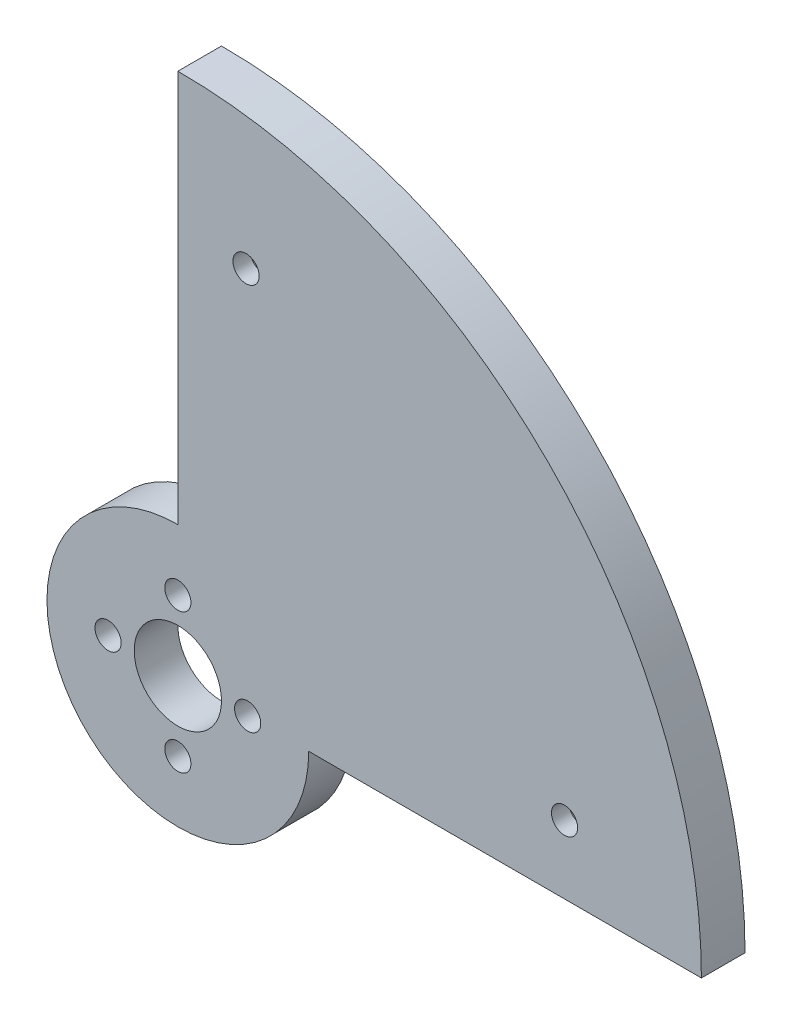
ISO-10303-21;
HEADER;
FILE_DESCRIPTION(('STEP AP214'),'2;1');
FILE_NAME('part.step','',(''),(''),'','','');
FILE_SCHEMA(('AUTOMOTIVE_DESIGN { 1 0 10303 214 1 1 1 1 }'));
ENDSEC;
DATA;
#1=APPLICATION_CONTEXT('core data for automotive mechanical design processes');
#2=APPLICATION_PROTOCOL_DEFINITION('international standard','automotive_design',2000,#1);
#3=PRODUCT_CONTEXT('',#1,'mechanical');
#4=PRODUCT('Part','Part','',(#3));
#5=PRODUCT_RELATED_PRODUCT_CATEGORY('part','',(#4));
#6=PRODUCT_DEFINITION_FORMATION('','',#4);
#7=PRODUCT_DEFINITION_CONTEXT('part definition',#1,'design');
#8=PRODUCT_DEFINITION('design','',#6,#7);
#9=PRODUCT_DEFINITION_SHAPE('','',#8);
#10=(LENGTH_UNIT() NAMED_UNIT(*) SI_UNIT(.MILLI.,.METRE.));
#11=(NAMED_UNIT(*) PLANE_ANGLE_UNIT() SI_UNIT($,.RADIAN.));
#12=(NAMED_UNIT(*) SI_UNIT($,.STERADIAN.) SOLID_ANGLE_UNIT());
#13=UNCERTAINTY_MEASURE_WITH_UNIT(LENGTH_MEASURE(1.E-05),#10,'distance_accuracy_value','');
#14=(GEOMETRIC_REPRESENTATION_CONTEXT(3) GLOBAL_UNCERTAINTY_ASSIGNED_CONTEXT((#13)) GLOBAL_UNIT_ASSIGNED_CONTEXT((#10,
#11,#12)) REPRESENTATION_CONTEXT('',''));
#15=CARTESIAN_POINT('',(0.,0.,0.));
#16=DIRECTION('',(0.,0.,1.));
#17=DIRECTION('',(1.,0.,0.));
#18=AXIS2_PLACEMENT_3D('',#15,#16,#17);
#19=CARTESIAN_POINT('',(60.,2.24184641920356E-13,5.));
#20=DIRECTION('',(0.,1.,0.));
#21=DIRECTION('',(-1.,0.,0.));
#22=AXIS2_PLACEMENT_3D('',#19,#20,#21);
#23=PLANE('',#22);
#24=DIRECTION('',(1.,0.,0.));
#25=VECTOR('',#24,1.);
#26=CARTESIAN_POINT('',(60.,2.24184641920356E-13,5.));
#27=LINE('',#26,#25);
#28=CARTESIAN_POINT('',(15.,0.,5.));
#29=VERTEX_POINT('',#28);
#30=CARTESIAN_POINT('',(60.,2.20510701522914E-13,5.));
#31=VERTEX_POINT('',#30);
#32=EDGE_CURVE('E101',#29,#31,#27,.T.);
#33=ORIENTED_EDGE('',*,*,#32,.F.);
#34=DIRECTION('',(0.,0.,1.));
#35=VECTOR('',#34,1.);
#36=CARTESIAN_POINT('',(15.,0.,0.));
#37=LINE('',#36,#35);
#38=CARTESIAN_POINT('',(15.,0.,0.));
#39=VERTEX_POINT('',#38);
#40=EDGE_CURVE('E173',#29,#39,#37,.F.);
#41=ORIENTED_EDGE('',*,*,#40,.T.);
#42=DIRECTION('',(1.,0.,0.));
#43=VECTOR('',#42,1.);
#44=CARTESIAN_POINT('',(60.,2.24184641920356E-13,0.));
#45=LINE('',#44,#43);
#46=CARTESIAN_POINT('',(60.,2.20510701522914E-13,0.));
#47=VERTEX_POINT('',#46);
#48=EDGE_CURVE('E86',#39,#47,#45,.T.);
#49=ORIENTED_EDGE('',*,*,#48,.T.);
#50=DIRECTION('',(0.,0.,-1.));
#51=VECTOR('',#50,1.);
#52=CARTESIAN_POINT('',(60.,2.20510701522914E-13,5.));
#53=LINE('',#52,#51);
#54=EDGE_CURVE('E81',#31,#47,#53,.T.);
#55=ORIENTED_EDGE('',*,*,#54,.F.);
#56=EDGE_LOOP('',(#33,#41,#49,#55));
#57=FACE_BOUND('',#56,.T.);
#58=ADVANCED_FACE('F37',(#57),#23,.F.);
#59=CARTESIAN_POINT('',(0.,0.,5.));
#60=DIRECTION('',(0.,0.,-1.));
#61=DIRECTION('',(-1.,0.,0.));
#62=AXIS2_PLACEMENT_3D('',#59,#60,#61);
#63=CYLINDRICAL_SURFACE('',#62,60.);
#64=CARTESIAN_POINT('',(0.,0.,0.));
#65=DIRECTION('',(0.,0.,1.));
#66=DIRECTION('',(-1.,0.,0.));
#67=AXIS2_PLACEMENT_3D('',#64,#65,#66);
#68=CIRCLE('',#67,60.);
#69=CARTESIAN_POINT('',(0.,60.,0.));
#70=VERTEX_POINT('',#69);
#71=EDGE_CURVE('E75',#47,#70,#68,.T.);
#72=ORIENTED_EDGE('',*,*,#71,.T.);
#73=DIRECTION('',(0.,0.,-1.));
#74=VECTOR('',#73,1.);
#75=CARTESIAN_POINT('',(0.,60.,5.));
#76=LINE('',#75,#74);
#77=CARTESIAN_POINT('',(0.,60.,5.));
#78=VERTEX_POINT('',#77);
#79=EDGE_CURVE('E78',#78,#70,#76,.T.);
#80=ORIENTED_EDGE('',*,*,#79,.F.);
#81=CARTESIAN_POINT('',(0.,0.,5.));
#82=DIRECTION('',(0.,0.,1.));
#83=DIRECTION('',(-1.,0.,0.));
#84=AXIS2_PLACEMENT_3D('',#81,#82,#83);
#85=CIRCLE('',#84,60.);
#86=EDGE_CURVE('E62',#31,#78,#85,.T.);
#87=ORIENTED_EDGE('',*,*,#86,.F.);
#88=ORIENTED_EDGE('',*,*,#54,.T.);
#89=EDGE_LOOP('',(#72,#80,#87,#88));
#90=FACE_BOUND('',#89,.T.);
#91=ADVANCED_FACE('F77',(#90),#63,.T.);
#92=CARTESIAN_POINT('',(0.,0.,5.));
#93=DIRECTION('',(1.,0.,0.));
#94=DIRECTION('',(0.,0.,-1.));
#95=AXIS2_PLACEMENT_3D('',#92,#93,#94);
#96=PLANE('',#95);
#97=DIRECTION('',(0.,-1.,0.));
#98=VECTOR('',#97,1.);
#99=CARTESIAN_POINT('',(0.,0.,0.));
#100=LINE('',#99,#98);
#101=CARTESIAN_POINT('',(0.,41.9615242270663,0.));
#102=VERTEX_POINT('',#101);
#103=EDGE_CURVE('E93',#70,#102,#100,.T.);
#104=ORIENTED_EDGE('',*,*,#103,.T.);
#105=DIRECTION('',(0.,0.,-1.));
#106=VECTOR('',#105,1.);
#107=CARTESIAN_POINT('',(0.,41.9615242270663,2.));
#108=LINE('',#107,#106);
#109=CARTESIAN_POINT('',(0.,41.9615242270663,2.));
#110=VERTEX_POINT('',#109);
#111=EDGE_CURVE('E145',#102,#110,#108,.F.);
#112=ORIENTED_EDGE('',*,*,#111,.T.);
#113=DIRECTION('',(0.,1.,0.));
#114=VECTOR('',#113,1.);
#115=CARTESIAN_POINT('',(0.,0.,2.));
#116=LINE('',#115,#114);
#117=CARTESIAN_POINT('',(0.,25.4300119907447,2.));
#118=VERTEX_POINT('',#117);
#119=EDGE_CURVE('E11',#118,#110,#116,.T.);
#120=ORIENTED_EDGE('',*,*,#119,.F.);
#121=DIRECTION('',(0.,0.,-1.));
#122=VECTOR('',#121,1.);
#123=CARTESIAN_POINT('',(0.,25.4300119907447,5.));
#124=LINE('',#123,#122);
#125=CARTESIAN_POINT('',(0.,25.4300119907447,0.));
#126=VERTEX_POINT('',#125);
#127=EDGE_CURVE('E142',#118,#126,#124,.T.);
#128=ORIENTED_EDGE('',*,*,#127,.T.);
#129=CARTESIAN_POINT('',(0.,15.,0.));
#130=VERTEX_POINT('',#129);
#131=EDGE_CURVE('E85',#126,#130,#100,.T.);
#132=ORIENTED_EDGE('',*,*,#131,.T.);
#133=DIRECTION('',(0.,0.,1.));
#134=VECTOR('',#133,1.);
#135=CARTESIAN_POINT('',(0.,15.,0.));
#136=LINE('',#135,#134);
#137=CARTESIAN_POINT('',(0.,15.,5.));
#138=VERTEX_POINT('',#137);
#139=EDGE_CURVE('E169',#130,#138,#136,.T.);
#140=ORIENTED_EDGE('',*,*,#139,.T.);
#141=DIRECTION('',(0.,-1.,0.));
#142=VECTOR('',#141,1.);
#143=CARTESIAN_POINT('',(0.,0.,5.));
#144=LINE('',#143,#142);
#145=EDGE_CURVE('E95',#78,#138,#144,.T.);
#146=ORIENTED_EDGE('',*,*,#145,.F.);
#147=ORIENTED_EDGE('',*,*,#79,.T.);
#148=EDGE_LOOP('',(#104,#112,#120,#128,#132,#140,#146,#147));
#149=FACE_BOUND('',#148,.T.);
#150=ADVANCED_FACE('F90',(#149),#96,.F.);
#151=CARTESIAN_POINT('',(0.,0.,5.));
#152=DIRECTION('',(0.,0.,-1.));
#153=DIRECTION('',(-1.,0.,0.));
#154=AXIS2_PLACEMENT_3D('',#151,#152,#153);
#155=PLANE('',#154);
#156=CARTESIAN_POINT('',(-7.99999999999946,-5.39736933647868E-13,5.));
#157=DIRECTION('',(0.,0.,1.));
#158=DIRECTION('',(1.,0.,0.));
#159=AXIS2_PLACEMENT_3D('',#156,#157,#158);
#160=CIRCLE('',#159,1.5);
#161=CARTESIAN_POINT('',(-6.49999999999946,-5.39736933647868E-13,5.));
#162=VERTEX_POINT('',#161);
#163=EDGE_CURVE('E129',#162,#162,#160,.T.);
#164=ORIENTED_EDGE('',*,*,#163,.F.);
#165=EDGE_LOOP('',(#164));
#166=FACE_BOUND('',#165,.T.);
#167=CARTESIAN_POINT('',(1.0775144324171E-12,-8.,5.));
#168=DIRECTION('',(0.,0.,1.));
#169=DIRECTION('',(1.,0.,0.));
#170=AXIS2_PLACEMENT_3D('',#167,#168,#169);
#171=CIRCLE('',#170,1.5);
#172=CARTESIAN_POINT('',(1.50000000000108,-8.,5.));
#173=VERTEX_POINT('',#172);
#174=EDGE_CURVE('E119',#173,#173,#171,.T.);
#175=ORIENTED_EDGE('',*,*,#174,.F.);
#176=EDGE_LOOP('',(#175));
#177=FACE_BOUND('',#176,.T.);
#178=CARTESIAN_POINT('',(8.00000000000054,5.3875721620855E-13,5.));
#179=DIRECTION('',(0.,0.,1.));
#180=DIRECTION('',(1.,0.,0.));
#181=AXIS2_PLACEMENT_3D('',#178,#179,#180);
#182=CIRCLE('',#181,1.5);
#183=CARTESIAN_POINT('',(9.50000000000054,5.3875721620855E-13,5.));
#184=VERTEX_POINT('',#183);
#185=EDGE_CURVE('E116',#184,#184,#182,.T.);
#186=ORIENTED_EDGE('',*,*,#185,.F.);
#187=EDGE_LOOP('',(#186));
#188=FACE_BOUND('',#187,.T.);
#189=CARTESIAN_POINT('',(0.,8.,5.));
#190=DIRECTION('',(0.,0.,1.));
#191=DIRECTION('',(1.,0.,0.));
#192=AXIS2_PLACEMENT_3D('',#189,#190,#191);
#193=CIRCLE('',#192,1.5);
#194=CARTESIAN_POINT('',(1.5,8.,5.));
#195=VERTEX_POINT('',#194);
#196=EDGE_CURVE('E113',#195,#195,#193,.T.);
#197=ORIENTED_EDGE('',*,*,#196,.F.);
#198=EDGE_LOOP('',(#197));
#199=FACE_BOUND('',#198,.T.);
#200=CARTESIAN_POINT('',(44.3163488855494,7.81416799501191,5.));
#201=DIRECTION('',(0.,0.,1.));
#202=DIRECTION('',(1.,0.,0.));
#203=AXIS2_PLACEMENT_3D('',#200,#201,#202);
#204=CIRCLE('',#203,1.5);
#205=CARTESIAN_POINT('',(45.8163488855494,7.81416799501191,5.));
#206=VERTEX_POINT('',#205);
#207=EDGE_CURVE('E147',#206,#206,#204,.T.);
#208=ORIENTED_EDGE('',*,*,#207,.F.);
#209=EDGE_LOOP('',(#208));
#210=FACE_BOUND('',#209,.T.);
#211=CARTESIAN_POINT('',(7.81416799501189,44.3163488855494,5.));
#212=DIRECTION('',(0.,0.,1.));
#213=DIRECTION('',(1.,0.,0.));
#214=AXIS2_PLACEMENT_3D('',#211,#212,#213);
#215=CIRCLE('',#214,1.5);
#216=CARTESIAN_POINT('',(9.31416799501189,44.3163488855494,5.));
#217=VERTEX_POINT('',#216);
#218=EDGE_CURVE('E151',#217,#217,#215,.T.);
#219=ORIENTED_EDGE('',*,*,#218,.F.);
#220=EDGE_LOOP('',(#219));
#221=FACE_BOUND('',#220,.T.);
#222=CARTESIAN_POINT('',(0.,0.,5.));
#223=DIRECTION('',(0.,0.,1.));
#224=DIRECTION('',(1.,0.,0.));
#225=AXIS2_PLACEMENT_3D('',#222,#223,#224);
#226=CIRCLE('',#225,5.);
#227=CARTESIAN_POINT('',(5.,0.,5.));
#228=VERTEX_POINT('',#227);
#229=EDGE_CURVE('E157',#228,#228,#226,.T.);
#230=ORIENTED_EDGE('',*,*,#229,.F.);
#231=EDGE_LOOP('',(#230));
#232=FACE_BOUND('',#231,.T.);
#233=CARTESIAN_POINT('',(0.,0.,5.));
#234=DIRECTION('',(0.,0.,1.));
#235=DIRECTION('',(1.,0.,0.));
#236=AXIS2_PLACEMENT_3D('',#233,#234,#235);
#237=CIRCLE('',#236,15.);
#238=EDGE_CURVE('E163',#138,#29,#237,.T.);
#239=ORIENTED_EDGE('',*,*,#238,.T.);
#240=ORIENTED_EDGE('',*,*,#32,.T.);
#241=ORIENTED_EDGE('',*,*,#86,.T.);
#242=ORIENTED_EDGE('',*,*,#145,.T.);
#243=EDGE_LOOP('',(#239,#240,#241,#242));
#244=FACE_BOUND('',#243,.T.);
#245=ADVANCED_FACE('F195',(#166,#177,#188,#199,#210,#221,#232,#244),#155,.F.);
#246=CARTESIAN_POINT('',(0.,0.,0.));
#247=DIRECTION('',(0.,0.,-1.));
#248=DIRECTION('',(-1.,0.,0.));
#249=AXIS2_PLACEMENT_3D('',#246,#247,#248);
#250=PLANE('',#249);
#251=CARTESIAN_POINT('',(-7.99999999999946,-5.39736933647868E-13,0.));
#252=DIRECTION('',(0.,0.,-1.));
#253=DIRECTION('',(-1.,0.,0.));
#254=AXIS2_PLACEMENT_3D('',#251,#252,#253);
#255=CIRCLE('',#254,1.5);
#256=CARTESIAN_POINT('',(-9.49999999999946,-5.39736933647868E-13,0.));
#257=VERTEX_POINT('',#256);
#258=EDGE_CURVE('E40',#257,#257,#255,.T.);
#259=ORIENTED_EDGE('',*,*,#258,.F.);
#260=EDGE_LOOP('',(#259));
#261=FACE_BOUND('',#260,.T.);
#262=CARTESIAN_POINT('',(1.0775144324171E-12,-8.,0.));
#263=DIRECTION('',(0.,0.,-1.));
#264=DIRECTION('',(-1.,0.,0.));
#265=AXIS2_PLACEMENT_3D('',#262,#263,#264);
#266=CIRCLE('',#265,1.5);
#267=CARTESIAN_POINT('',(-1.49999999999892,-8.,0.));
#268=VERTEX_POINT('',#267);
#269=EDGE_CURVE('E117',#268,#268,#266,.T.);
#270=ORIENTED_EDGE('',*,*,#269,.F.);
#271=EDGE_LOOP('',(#270));
#272=FACE_BOUND('',#271,.T.);
#273=CARTESIAN_POINT('',(8.00000000000054,5.3875721620855E-13,0.));
#274=DIRECTION('',(0.,0.,-1.));
#275=DIRECTION('',(-1.,0.,0.));
#276=AXIS2_PLACEMENT_3D('',#273,#274,#275);
#277=CIRCLE('',#276,1.5);
#278=CARTESIAN_POINT('',(6.50000000000054,5.3875721620855E-13,0.));
#279=VERTEX_POINT('',#278);
#280=EDGE_CURVE('E114',#279,#279,#277,.T.);
#281=ORIENTED_EDGE('',*,*,#280,.F.);
#282=EDGE_LOOP('',(#281));
#283=FACE_BOUND('',#282,.T.);
#284=CARTESIAN_POINT('',(0.,8.,0.));
#285=DIRECTION('',(0.,0.,-1.));
#286=DIRECTION('',(-1.,0.,0.));
#287=AXIS2_PLACEMENT_3D('',#284,#285,#286);
#288=CIRCLE('',#287,1.5);
#289=CARTESIAN_POINT('',(-1.5,8.,0.));
#290=VERTEX_POINT('',#289);
#291=EDGE_CURVE('E109',#290,#290,#288,.T.);
#292=ORIENTED_EDGE('',*,*,#291,.F.);
#293=EDGE_LOOP('',(#292));
#294=FACE_BOUND('',#293,.T.);
#295=CARTESIAN_POINT('',(-30.,-10.,0.));
#296=DIRECTION('',(0.,0.,-1.));
#297=DIRECTION('',(-1.,0.,0.));
#298=AXIS2_PLACEMENT_3D('',#295,#296,#297);
#299=CIRCLE('',#298,60.);
#300=CARTESIAN_POINT('',(8.77216715242746,35.7899449039221,0.));
#301=VERTEX_POINT('',#300);
#302=EDGE_CURVE('E45',#102,#301,#299,.T.);
#303=ORIENTED_EDGE('',*,*,#302,.F.);
#304=ORIENTED_EDGE('',*,*,#103,.F.);
#305=ORIENTED_EDGE('',*,*,#71,.F.);
#306=ORIENTED_EDGE('',*,*,#48,.F.);
#307=CARTESIAN_POINT('',(0.,0.,0.));
#308=DIRECTION('',(0.,0.,1.));
#309=DIRECTION('',(1.,0.,0.));
#310=AXIS2_PLACEMENT_3D('',#307,#308,#309);
#311=CIRCLE('',#310,15.);
#312=EDGE_CURVE('E166',#130,#39,#311,.T.);
#313=ORIENTED_EDGE('',*,*,#312,.F.);
#314=ORIENTED_EDGE('',*,*,#131,.F.);
#315=DIRECTION('',(-0.646202785873791,-0.763165748398703,0.));
#316=VECTOR('',#315,1.);
#317=CARTESIAN_POINT('',(8.77216715242746,35.7899449039221,0.));
#318=LINE('',#317,#316);
#319=EDGE_CURVE('E112',#301,#126,#318,.T.);
#320=ORIENTED_EDGE('',*,*,#319,.F.);
#321=EDGE_LOOP('',(#303,#304,#305,#306,#313,#314,#320));
#322=FACE_BOUND('',#321,.T.);
#323=CARTESIAN_POINT('',(0.,0.,0.));
#324=DIRECTION('',(0.,0.,1.));
#325=DIRECTION('',(1.,0.,0.));
#326=AXIS2_PLACEMENT_3D('',#323,#324,#325);
#327=CIRCLE('',#326,5.);
#328=CARTESIAN_POINT('',(5.,0.,0.));
#329=VERTEX_POINT('',#328);
#330=EDGE_CURVE('E160',#329,#329,#327,.T.);
#331=ORIENTED_EDGE('',*,*,#330,.T.);
#332=EDGE_LOOP('',(#331));
#333=FACE_BOUND('',#332,.T.);
#334=ADVANCED_FACE('F98',(#261,#272,#283,#294,#322,#333),#250,.T.);
#335=CARTESIAN_POINT('',(0.,0.,0.));
#336=DIRECTION('',(0.,0.,1.));
#337=DIRECTION('',(1.,0.,0.));
#338=AXIS2_PLACEMENT_3D('',#335,#336,#337);
#339=CYLINDRICAL_SURFACE('',#338,15.);
#340=ORIENTED_EDGE('',*,*,#40,.F.);
#341=ORIENTED_EDGE('',*,*,#238,.F.);
#342=ORIENTED_EDGE('',*,*,#139,.F.);
#343=ORIENTED_EDGE('',*,*,#312,.T.);
#344=EDGE_LOOP('',(#340,#341,#342,#343));
#345=FACE_BOUND('',#344,.T.);
#346=ADVANCED_FACE('F194',(#345),#339,.T.);
#347=CARTESIAN_POINT('',(0.,0.,0.));
#348=DIRECTION('',(0.,0.,1.));
#349=DIRECTION('',(1.,0.,0.));
#350=AXIS2_PLACEMENT_3D('',#347,#348,#349);
#351=CYLINDRICAL_SURFACE('',#350,5.);
#352=ORIENTED_EDGE('',*,*,#330,.F.);
#353=EDGE_LOOP('',(#352));
#354=FACE_BOUND('',#353,.T.);
#355=ORIENTED_EDGE('',*,*,#229,.T.);
#356=EDGE_LOOP('',(#355));
#357=FACE_BOUND('',#356,.T.);
#358=ADVANCED_FACE('F326',(#354,#357),#351,.F.);
#359=CARTESIAN_POINT('',(7.81416799501189,44.3163488855494,3.));
#360=DIRECTION('',(0.,0.,1.));
#361=DIRECTION('',(1.,0.,0.));
#362=AXIS2_PLACEMENT_3D('',#359,#360,#361);
#363=CYLINDRICAL_SURFACE('',#362,1.5);
#364=CARTESIAN_POINT('',(7.81416799501189,44.3163488855494,3.));
#365=DIRECTION('',(0.,0.,1.));
#366=DIRECTION('',(1.,0.,0.));
#367=AXIS2_PLACEMENT_3D('',#364,#365,#366);
#368=CIRCLE('',#367,1.5);
#369=CARTESIAN_POINT('',(9.31416799501189,44.3163488855494,3.));
#370=VERTEX_POINT('',#369);
#371=EDGE_CURVE('E154',#370,#370,#368,.T.);
#372=ORIENTED_EDGE('',*,*,#371,.F.);
#373=EDGE_LOOP('',(#372));
#374=FACE_BOUND('',#373,.T.);
#375=ORIENTED_EDGE('',*,*,#218,.T.);
#376=EDGE_LOOP('',(#375));
#377=FACE_BOUND('',#376,.T.);
#378=ADVANCED_FACE('F322',(#374,#377),#363,.F.);
#379=CARTESIAN_POINT('',(7.81416799501189,44.3163488855494,3.));
#380=DIRECTION('',(0.,0.,1.));
#381=DIRECTION('',(1.,0.,0.));
#382=AXIS2_PLACEMENT_3D('',#379,#380,#381);
#383=PLANE('',#382);
#384=ORIENTED_EDGE('',*,*,#371,.T.);
#385=EDGE_LOOP('',(#384));
#386=FACE_BOUND('',#385,.T.);
#387=ADVANCED_FACE('F318',(#386),#383,.T.);
#388=CARTESIAN_POINT('',(44.3163488855494,7.81416799501191,3.));
#389=DIRECTION('',(0.,0.,1.));
#390=DIRECTION('',(1.,0.,0.));
#391=AXIS2_PLACEMENT_3D('',#388,#389,#390);
#392=CYLINDRICAL_SURFACE('',#391,1.5);
#393=CARTESIAN_POINT('',(44.3163488855494,7.81416799501191,3.));
#394=DIRECTION('',(0.,0.,1.));
#395=DIRECTION('',(1.,0.,0.));
#396=AXIS2_PLACEMENT_3D('',#393,#394,#395);
#397=CIRCLE('',#396,1.5);
#398=CARTESIAN_POINT('',(45.8163488855494,7.81416799501191,3.));
#399=VERTEX_POINT('',#398);
#400=EDGE_CURVE('E148',#399,#399,#397,.T.);
#401=ORIENTED_EDGE('',*,*,#400,.F.);
#402=EDGE_LOOP('',(#401));
#403=FACE_BOUND('',#402,.T.);
#404=ORIENTED_EDGE('',*,*,#207,.T.);
#405=EDGE_LOOP('',(#404));
#406=FACE_BOUND('',#405,.T.);
#407=ADVANCED_FACE('F314',(#403,#406),#392,.F.);
#408=CARTESIAN_POINT('',(44.3163488855494,7.81416799501191,3.));
#409=DIRECTION('',(0.,0.,1.));
#410=DIRECTION('',(1.,0.,0.));
#411=AXIS2_PLACEMENT_3D('',#408,#409,#410);
#412=PLANE('',#411);
#413=ORIENTED_EDGE('',*,*,#400,.T.);
#414=EDGE_LOOP('',(#413));
#415=FACE_BOUND('',#414,.T.);
#416=ADVANCED_FACE('F226',(#415),#412,.T.);
#417=CARTESIAN_POINT('',(-30.,-10.,2.));
#418=DIRECTION('',(0.,0.,-1.));
#419=DIRECTION('',(-1.,0.,0.));
#420=AXIS2_PLACEMENT_3D('',#417,#418,#419);
#421=PLANE('',#420);
#422=ORIENTED_EDGE('',*,*,#119,.T.);
#423=CARTESIAN_POINT('',(-30.,-10.,2.));
#424=DIRECTION('',(0.,0.,-1.));
#425=DIRECTION('',(-1.,0.,0.));
#426=AXIS2_PLACEMENT_3D('',#423,#424,#425);
#427=CIRCLE('',#426,60.);
#428=CARTESIAN_POINT('',(8.77216715242746,35.7899449039221,2.));
#429=VERTEX_POINT('',#428);
#430=EDGE_CURVE('E134',#110,#429,#427,.T.);
#431=ORIENTED_EDGE('',*,*,#430,.T.);
#432=DIRECTION('',(-0.646202785873791,-0.763165748398703,0.));
#433=VECTOR('',#432,1.);
#434=CARTESIAN_POINT('',(8.77216715242746,35.7899449039221,2.));
#435=LINE('',#434,#433);
#436=EDGE_CURVE('E137',#429,#118,#435,.T.);
#437=ORIENTED_EDGE('',*,*,#436,.T.);
#438=EDGE_LOOP('',(#422,#431,#437));
#439=FACE_BOUND('',#438,.T.);
#440=ADVANCED_FACE('F231',(#439),#421,.T.);
#441=CARTESIAN_POINT('',(-30.,-10.,2.));
#442=DIRECTION('',(0.,0.,-1.));
#443=DIRECTION('',(-1.,0.,0.));
#444=AXIS2_PLACEMENT_3D('',#441,#442,#443);
#445=CYLINDRICAL_SURFACE('',#444,60.);
#446=ORIENTED_EDGE('',*,*,#302,.T.);
#447=DIRECTION('',(0.,0.,-1.));
#448=VECTOR('',#447,1.);
#449=CARTESIAN_POINT('',(8.77216715242746,35.7899449039221,2.));
#450=LINE('',#449,#448);
#451=EDGE_CURVE('E53',#429,#301,#450,.T.);
#452=ORIENTED_EDGE('',*,*,#451,.F.);
#453=ORIENTED_EDGE('',*,*,#430,.F.);
#454=ORIENTED_EDGE('',*,*,#111,.F.);
#455=EDGE_LOOP('',(#446,#452,#453,#454));
#456=FACE_BOUND('',#455,.T.);
#457=ADVANCED_FACE('F236',(#456),#445,.F.);
#458=CARTESIAN_POINT('',(8.77216715242746,35.7899449039221,2.));
#459=DIRECTION('',(0.763165748398703,-0.646202785873791,0.));
#460=DIRECTION('',(0.646202785873791,0.763165748398703,0.));
#461=AXIS2_PLACEMENT_3D('',#458,#459,#460);
#462=PLANE('',#461);
#463=ORIENTED_EDGE('',*,*,#436,.F.);
#464=ORIENTED_EDGE('',*,*,#451,.T.);
#465=ORIENTED_EDGE('',*,*,#319,.T.);
#466=ORIENTED_EDGE('',*,*,#127,.F.);
#467=EDGE_LOOP('',(#463,#464,#465,#466));
#468=FACE_BOUND('',#467,.T.);
#469=ADVANCED_FACE('F246',(#468),#462,.F.);
#470=CARTESIAN_POINT('',(0.,8.,-5.));
#471=DIRECTION('',(0.,0.,1.));
#472=DIRECTION('',(1.,0.,0.));
#473=AXIS2_PLACEMENT_3D('',#470,#471,#472);
#474=CYLINDRICAL_SURFACE('',#473,1.5);
#475=ORIENTED_EDGE('',*,*,#291,.T.);
#476=EDGE_LOOP('',(#475));
#477=FACE_BOUND('',#476,.T.);
#478=ORIENTED_EDGE('',*,*,#196,.T.);
#479=EDGE_LOOP('',(#478));
#480=FACE_BOUND('',#479,.T.);
#481=ADVANCED_FACE('F255',(#477,#480),#474,.F.);
#482=CARTESIAN_POINT('',(8.00000000000054,5.3875721620855E-13,-5.));
#483=DIRECTION('',(0.,0.,1.));
#484=DIRECTION('',(1.,0.,0.));
#485=AXIS2_PLACEMENT_3D('',#482,#483,#484);
#486=CYLINDRICAL_SURFACE('',#485,1.5);
#487=ORIENTED_EDGE('',*,*,#280,.T.);
#488=EDGE_LOOP('',(#487));
#489=FACE_BOUND('',#488,.T.);
#490=ORIENTED_EDGE('',*,*,#185,.T.);
#491=EDGE_LOOP('',(#490));
#492=FACE_BOUND('',#491,.T.);
#493=ADVANCED_FACE('F278',(#489,#492),#486,.F.);
#494=CARTESIAN_POINT('',(1.0775144324171E-12,-8.,-5.));
#495=DIRECTION('',(0.,0.,1.));
#496=DIRECTION('',(1.,0.,0.));
#497=AXIS2_PLACEMENT_3D('',#494,#495,#496);
#498=CYLINDRICAL_SURFACE('',#497,1.5);
#499=ORIENTED_EDGE('',*,*,#269,.T.);
#500=EDGE_LOOP('',(#499));
#501=FACE_BOUND('',#500,.T.);
#502=ORIENTED_EDGE('',*,*,#174,.T.);
#503=EDGE_LOOP('',(#502));
#504=FACE_BOUND('',#503,.T.);
#505=ADVANCED_FACE('F288',(#501,#504),#498,.F.);
#506=CARTESIAN_POINT('',(-7.99999999999946,-5.39736933647868E-13,-5.));
#507=DIRECTION('',(0.,0.,1.));
#508=DIRECTION('',(1.,0.,0.));
#509=AXIS2_PLACEMENT_3D('',#506,#507,#508);
#510=CYLINDRICAL_SURFACE('',#509,1.5);
#511=ORIENTED_EDGE('',*,*,#258,.T.);
#512=EDGE_LOOP('',(#511));
#513=FACE_BOUND('',#512,.T.);
#514=ORIENTED_EDGE('',*,*,#163,.T.);
#515=EDGE_LOOP('',(#514));
#516=FACE_BOUND('',#515,.T.);
#517=ADVANCED_FACE('F298',(#513,#516),#510,.F.);
#518=CLOSED_SHELL('',(#58,#91,#150,#245,#334,#346,#358,#378,#387,#407,#416,#440,#457,#469,#481,
#493,#505,#517));
#519=MANIFOLD_SOLID_BREP('B2',#518);
#520=ADVANCED_BREP_SHAPE_REPRESENTATION('',(#18,#519),#14);
#521=SHAPE_DEFINITION_REPRESENTATION(#9,#520);
ENDSEC;
END-ISO-10303-21;
